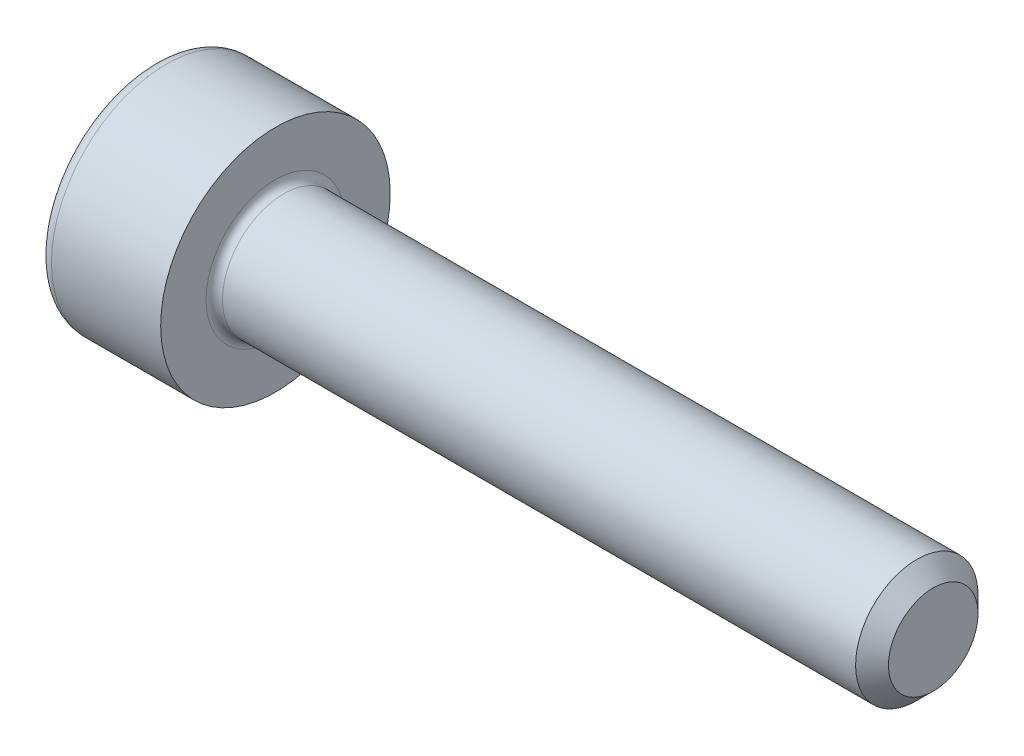
ISO-10303-21;
HEADER;
FILE_DESCRIPTION(('STEP AP214'),'2;1');
FILE_NAME('part.step','',(''),(''),'','','');
FILE_SCHEMA(('AUTOMOTIVE_DESIGN { 1 0 10303 214 1 1 1 1 }'));
ENDSEC;
DATA;
#1=APPLICATION_CONTEXT('core data for automotive mechanical design processes');
#2=APPLICATION_PROTOCOL_DEFINITION('international standard','automotive_design',2000,#1);
#3=PRODUCT_CONTEXT('',#1,'mechanical');
#4=PRODUCT('Part','Part','',(#3));
#5=PRODUCT_RELATED_PRODUCT_CATEGORY('part','',(#4));
#6=PRODUCT_DEFINITION_FORMATION('','',#4);
#7=PRODUCT_DEFINITION_CONTEXT('part definition',#1,'design');
#8=PRODUCT_DEFINITION('design','',#6,#7);
#9=PRODUCT_DEFINITION_SHAPE('','',#8);
#10=(LENGTH_UNIT() NAMED_UNIT(*) SI_UNIT(.MILLI.,.METRE.));
#11=(NAMED_UNIT(*) PLANE_ANGLE_UNIT() SI_UNIT($,.RADIAN.));
#12=(NAMED_UNIT(*) SI_UNIT($,.STERADIAN.) SOLID_ANGLE_UNIT());
#13=UNCERTAINTY_MEASURE_WITH_UNIT(LENGTH_MEASURE(1.E-05),#10,'distance_accuracy_value','');
#14=(GEOMETRIC_REPRESENTATION_CONTEXT(3) GLOBAL_UNCERTAINTY_ASSIGNED_CONTEXT((#13)) GLOBAL_UNIT_ASSIGNED_CONTEXT((#10,
#11,#12)) REPRESENTATION_CONTEXT('',''));
#15=CARTESIAN_POINT('',(0.,0.,0.));
#16=DIRECTION('',(0.,0.,1.));
#17=DIRECTION('',(1.,0.,0.));
#18=AXIS2_PLACEMENT_3D('',#15,#16,#17);
#19=CARTESIAN_POINT('',(0.,0.,0.));
#20=DIRECTION('',(-1.,0.,0.));
#21=DIRECTION('',(0.,0.,1.));
#22=AXIS2_PLACEMENT_3D('',#19,#20,#21);
#23=CYLINDRICAL_SURFACE('',#22,1.39568824458778);
#24=CARTESIAN_POINT('',(0.16,0.,0.));
#25=DIRECTION('',(1.,0.,0.));
#26=DIRECTION('',(0.,0.,-1.));
#27=AXIS2_PLACEMENT_3D('',#24,#25,#26);
#28=CIRCLE('',#27,1.39568824458778);
#29=CARTESIAN_POINT('',(0.16,0.,-1.39568824458778));
#30=VERTEX_POINT('',#29);
#31=EDGE_CURVE('E157',#30,#30,#28,.T.);
#32=ORIENTED_EDGE('',*,*,#31,.T.);
#33=EDGE_LOOP('',(#32));
#34=FACE_BOUND('',#33,.T.);
#35=CARTESIAN_POINT('',(1.48873412756029,0.,0.));
#36=DIRECTION('',(-1.,0.,0.));
#37=DIRECTION('',(0.,0.,1.));
#38=AXIS2_PLACEMENT_3D('',#35,#36,#37);
#39=CIRCLE('',#38,1.39568824458778);
#40=CARTESIAN_POINT('',(1.48873412756029,0.,1.39568824458778));
#41=VERTEX_POINT('',#40);
#42=EDGE_CURVE('E140',#41,#41,#39,.T.);
#43=ORIENTED_EDGE('',*,*,#42,.T.);
#44=EDGE_LOOP('',(#43));
#45=FACE_BOUND('',#44,.T.);
#46=ADVANCED_FACE('F38',(#34,#45),#23,.T.);
#47=CARTESIAN_POINT('',(0.,0.,0.));
#48=DIRECTION('',(1.,0.,0.));
#49=DIRECTION('',(0.,0.,-1.));
#50=AXIS2_PLACEMENT_3D('',#47,#48,#49);
#51=PLANE('',#50);
#52=DIRECTION('',(0.,-0.5,-0.866025403784439));
#53=VECTOR('',#52,1.);
#54=CARTESIAN_POINT('',(0.,0.877572409168232,0.));
#55=LINE('',#54,#53);
#56=CARTESIAN_POINT('',(0.,0.877572409168232,0.));
#57=VERTEX_POINT('',#56);
#58=CARTESIAN_POINT('',(0.,0.438786204584116,-0.760000000000001));
#59=VERTEX_POINT('',#58);
#60=EDGE_CURVE('E127',#57,#59,#55,.T.);
#61=ORIENTED_EDGE('',*,*,#60,.F.);
#62=DIRECTION('',(0.,0.5,-0.866025403784439));
#63=VECTOR('',#62,1.);
#64=CARTESIAN_POINT('',(0.,0.438786204584116,0.76));
#65=LINE('',#64,#63);
#66=CARTESIAN_POINT('',(0.,0.438786204584116,0.76));
#67=VERTEX_POINT('',#66);
#68=EDGE_CURVE('E53',#67,#57,#65,.T.);
#69=ORIENTED_EDGE('',*,*,#68,.F.);
#70=DIRECTION('',(0.,1.,0.));
#71=VECTOR('',#70,1.);
#72=CARTESIAN_POINT('',(0.,-0.438786204584116,0.76));
#73=LINE('',#72,#71);
#74=CARTESIAN_POINT('',(0.,-0.438786204584116,0.76));
#75=VERTEX_POINT('',#74);
#76=EDGE_CURVE('E136',#75,#67,#73,.T.);
#77=ORIENTED_EDGE('',*,*,#76,.F.);
#78=DIRECTION('',(0.,0.5,0.866025403784439));
#79=VECTOR('',#78,1.);
#80=CARTESIAN_POINT('',(0.,-0.877572409168232,0.));
#81=LINE('',#80,#79);
#82=CARTESIAN_POINT('',(0.,-0.877572409168232,0.));
#83=VERTEX_POINT('',#82);
#84=EDGE_CURVE('E134',#83,#75,#81,.T.);
#85=ORIENTED_EDGE('',*,*,#84,.F.);
#86=DIRECTION('',(0.,-0.5,0.866025403784438));
#87=VECTOR('',#86,1.);
#88=CARTESIAN_POINT('',(0.,-0.438786204584116,-0.760000000000001));
#89=LINE('',#88,#87);
#90=CARTESIAN_POINT('',(0.,-0.438786204584116,-0.760000000000001));
#91=VERTEX_POINT('',#90);
#92=EDGE_CURVE('E101',#91,#83,#89,.T.);
#93=ORIENTED_EDGE('',*,*,#92,.F.);
#94=DIRECTION('',(0.,-1.,0.));
#95=VECTOR('',#94,1.);
#96=CARTESIAN_POINT('',(0.,0.438786204584116,-0.760000000000001));
#97=LINE('',#96,#95);
#98=EDGE_CURVE('E130',#59,#91,#97,.T.);
#99=ORIENTED_EDGE('',*,*,#98,.F.);
#100=EDGE_LOOP('',(#61,#69,#77,#85,#93,#99));
#101=FACE_BOUND('',#100,.T.);
#102=CARTESIAN_POINT('',(0.,0.,0.));
#103=DIRECTION('',(1.,0.,0.));
#104=DIRECTION('',(0.,0.,-1.));
#105=AXIS2_PLACEMENT_3D('',#102,#103,#104);
#106=CIRCLE('',#105,1.23568824458778);
#107=CARTESIAN_POINT('',(0.,0.,-1.23568824458778));
#108=VERTEX_POINT('',#107);
#109=EDGE_CURVE('E154',#108,#108,#106,.F.);
#110=ORIENTED_EDGE('',*,*,#109,.T.);
#111=EDGE_LOOP('',(#110));
#112=FACE_BOUND('',#111,.T.);
#113=ADVANCED_FACE('F179',(#101,#112),#51,.F.);
#114=CARTESIAN_POINT('',(9.48873412756029,0.,0.));
#115=DIRECTION('',(-1.,0.,0.));
#116=DIRECTION('',(0.,0.,1.));
#117=AXIS2_PLACEMENT_3D('',#114,#115,#116);
#118=PLANE('',#117);
#119=CARTESIAN_POINT('',(9.48873412756029,0.,0.));
#120=DIRECTION('',(-1.,0.,0.));
#121=DIRECTION('',(0.,0.,1.));
#122=AXIS2_PLACEMENT_3D('',#119,#120,#121);
#123=CIRCLE('',#122,0.544367063780148);
#124=CARTESIAN_POINT('',(9.48873412756029,0.,0.544367063780148));
#125=VERTEX_POINT('',#124);
#126=EDGE_CURVE('E11',#125,#125,#123,.F.);
#127=ORIENTED_EDGE('',*,*,#126,.T.);
#128=EDGE_LOOP('',(#127));
#129=FACE_BOUND('',#128,.T.);
#130=ADVANCED_FACE('F185',(#129),#118,.F.);
#131=CARTESIAN_POINT('',(0.,0.,0.));
#132=DIRECTION('',(-1.,0.,0.));
#133=DIRECTION('',(0.,0.,1.));
#134=AXIS2_PLACEMENT_3D('',#131,#132,#133);
#135=CYLINDRICAL_SURFACE('',#134,0.744367063780147);
#136=CARTESIAN_POINT('',(9.2887341275603,0.,0.));
#137=DIRECTION('',(-1.,0.,0.));
#138=DIRECTION('',(0.,0.,1.));
#139=AXIS2_PLACEMENT_3D('',#136,#137,#138);
#140=CIRCLE('',#139,0.744367063780147);
#141=CARTESIAN_POINT('',(9.2887341275603,0.,0.744367063780147));
#142=VERTEX_POINT('',#141);
#143=EDGE_CURVE('E46',#142,#142,#140,.T.);
#144=ORIENTED_EDGE('',*,*,#143,.T.);
#145=EDGE_LOOP('',(#144));
#146=FACE_BOUND('',#145,.T.);
#147=CARTESIAN_POINT('',(1.58873412756029,0.,0.));
#148=DIRECTION('',(-1.,0.,0.));
#149=DIRECTION('',(0.,0.,1.));
#150=AXIS2_PLACEMENT_3D('',#147,#148,#149);
#151=CIRCLE('',#150,0.744367063780147);
#152=CARTESIAN_POINT('',(1.58873412756029,0.,0.744367063780147));
#153=VERTEX_POINT('',#152);
#154=EDGE_CURVE('E151',#153,#153,#151,.F.);
#155=ORIENTED_EDGE('',*,*,#154,.T.);
#156=EDGE_LOOP('',(#155));
#157=FACE_BOUND('',#156,.T.);
#158=ADVANCED_FACE('F162',(#146,#157),#135,.T.);
#159=CARTESIAN_POINT('',(1.48873412756029,0.,0.));
#160=DIRECTION('',(-1.,0.,0.));
#161=DIRECTION('',(0.,0.,1.));
#162=AXIS2_PLACEMENT_3D('',#159,#160,#161);
#163=PLANE('',#162);
#164=CARTESIAN_POINT('',(1.48873412756029,0.,0.));
#165=DIRECTION('',(-1.,0.,0.));
#166=DIRECTION('',(0.,0.,1.));
#167=AXIS2_PLACEMENT_3D('',#164,#165,#166);
#168=CIRCLE('',#167,0.844367063780147);
#169=CARTESIAN_POINT('',(1.48873412756029,0.,0.844367063780147));
#170=VERTEX_POINT('',#169);
#171=EDGE_CURVE('E148',#170,#170,#168,.T.);
#172=ORIENTED_EDGE('',*,*,#171,.T.);
#173=EDGE_LOOP('',(#172));
#174=FACE_BOUND('',#173,.T.);
#175=ORIENTED_EDGE('',*,*,#42,.F.);
#176=EDGE_LOOP('',(#175));
#177=FACE_BOUND('',#176,.T.);
#178=ADVANCED_FACE('F192',(#174,#177),#163,.F.);
#179=CARTESIAN_POINT('',(1.58873412756029,0.,0.));
#180=DIRECTION('',(-1.,0.,0.));
#181=DIRECTION('',(0.,0.,1.));
#182=AXIS2_PLACEMENT_3D('',#179,#180,#181);
#183=TOROIDAL_SURFACE('',#182,0.844367063780147,0.1);
#184=ORIENTED_EDGE('',*,*,#154,.F.);
#185=EDGE_LOOP('',(#184));
#186=FACE_BOUND('',#185,.T.);
#187=ORIENTED_EDGE('',*,*,#171,.F.);
#188=EDGE_LOOP('',(#187));
#189=FACE_BOUND('',#188,.T.);
#190=ADVANCED_FACE('F175',(#186,#189),#183,.F.);
#191=CARTESIAN_POINT('',(0.16,0.,0.));
#192=DIRECTION('',(1.,0.,0.));
#193=DIRECTION('',(0.,0.,-1.));
#194=AXIS2_PLACEMENT_3D('',#191,#192,#193);
#195=TOROIDAL_SURFACE('',#194,1.23568824458778,0.16);
#196=ORIENTED_EDGE('',*,*,#31,.F.);
#197=EDGE_LOOP('',(#196));
#198=FACE_BOUND('',#197,.T.);
#199=ORIENTED_EDGE('',*,*,#109,.F.);
#200=EDGE_LOOP('',(#199));
#201=FACE_BOUND('',#200,.T.);
#202=ADVANCED_FACE('F167',(#198,#201),#195,.T.);
#203=CARTESIAN_POINT('',(9.2887341275603,0.,0.));
#204=DIRECTION('',(-1.,0.,0.));
#205=DIRECTION('',(0.,0.,1.));
#206=AXIS2_PLACEMENT_3D('',#203,#204,#205);
#207=CONICAL_SURFACE('',#206,0.744367063780147,0.785398163397451);
#208=ORIENTED_EDGE('',*,*,#126,.F.);
#209=EDGE_LOOP('',(#208));
#210=FACE_BOUND('',#209,.T.);
#211=ORIENTED_EDGE('',*,*,#143,.F.);
#212=EDGE_LOOP('',(#211));
#213=FACE_BOUND('',#212,.T.);
#214=ADVANCED_FACE('F40',(#210,#213),#207,.T.);
#215=CARTESIAN_POINT('',(0.7,0.438786204584116,0.76));
#216=DIRECTION('',(0.,0.866025403784439,0.5));
#217=DIRECTION('',(0.,-0.5,0.866025403784439));
#218=AXIS2_PLACEMENT_3D('',#215,#216,#217);
#219=PLANE('',#218);
#220=ORIENTED_EDGE('',*,*,#68,.T.);
#221=DIRECTION('',(-1.,0.,0.));
#222=VECTOR('',#221,1.);
#223=CARTESIAN_POINT('',(0.7,0.877572409168232,0.));
#224=LINE('',#223,#222);
#225=CARTESIAN_POINT('',(0.7,0.877572409168232,0.));
#226=VERTEX_POINT('',#225);
#227=EDGE_CURVE('E83',#226,#57,#224,.T.);
#228=ORIENTED_EDGE('',*,*,#227,.F.);
#229=DIRECTION('',(0.,0.5,-0.866025403784439));
#230=VECTOR('',#229,1.);
#231=CARTESIAN_POINT('',(0.7,0.438786204584116,0.76));
#232=LINE('',#231,#230);
#233=CARTESIAN_POINT('',(0.7,0.438786204584116,0.76));
#234=VERTEX_POINT('',#233);
#235=EDGE_CURVE('E138',#234,#226,#232,.T.);
#236=ORIENTED_EDGE('',*,*,#235,.F.);
#237=DIRECTION('',(-1.,0.,0.));
#238=VECTOR('',#237,1.);
#239=CARTESIAN_POINT('',(0.7,0.438786204584116,0.76));
#240=LINE('',#239,#238);
#241=EDGE_CURVE('E61',#234,#67,#240,.T.);
#242=ORIENTED_EDGE('',*,*,#241,.T.);
#243=EDGE_LOOP('',(#220,#228,#236,#242));
#244=FACE_BOUND('',#243,.T.);
#245=ADVANCED_FACE('F166',(#244),#219,.F.);
#246=CARTESIAN_POINT('',(0.7,-0.438786204584116,0.76));
#247=DIRECTION('',(0.,0.,1.));
#248=DIRECTION('',(1.,0.,0.));
#249=AXIS2_PLACEMENT_3D('',#246,#247,#248);
#250=PLANE('',#249);
#251=ORIENTED_EDGE('',*,*,#76,.T.);
#252=ORIENTED_EDGE('',*,*,#241,.F.);
#253=DIRECTION('',(0.,1.,0.));
#254=VECTOR('',#253,1.);
#255=CARTESIAN_POINT('',(0.7,-0.438786204584116,0.76));
#256=LINE('',#255,#254);
#257=CARTESIAN_POINT('',(0.7,-0.438786204584116,0.76));
#258=VERTEX_POINT('',#257);
#259=EDGE_CURVE('E113',#258,#234,#256,.T.);
#260=ORIENTED_EDGE('',*,*,#259,.F.);
#261=DIRECTION('',(-1.,0.,0.));
#262=VECTOR('',#261,1.);
#263=CARTESIAN_POINT('',(0.7,-0.438786204584116,0.76));
#264=LINE('',#263,#262);
#265=EDGE_CURVE('E105',#258,#75,#264,.T.);
#266=ORIENTED_EDGE('',*,*,#265,.T.);
#267=EDGE_LOOP('',(#251,#252,#260,#266));
#268=FACE_BOUND('',#267,.T.);
#269=ADVANCED_FACE('F173',(#268),#250,.F.);
#270=CARTESIAN_POINT('',(0.7,-0.877572409168232,0.));
#271=DIRECTION('',(0.,-0.866025403784439,0.5));
#272=DIRECTION('',(0.,-0.5,-0.866025403784439));
#273=AXIS2_PLACEMENT_3D('',#270,#271,#272);
#274=PLANE('',#273);
#275=ORIENTED_EDGE('',*,*,#84,.T.);
#276=ORIENTED_EDGE('',*,*,#265,.F.);
#277=DIRECTION('',(0.,0.5,0.866025403784439));
#278=VECTOR('',#277,1.);
#279=CARTESIAN_POINT('',(0.7,-0.877572409168232,0.));
#280=LINE('',#279,#278);
#281=CARTESIAN_POINT('',(0.7,-0.877572409168232,0.));
#282=VERTEX_POINT('',#281);
#283=EDGE_CURVE('E109',#282,#258,#280,.T.);
#284=ORIENTED_EDGE('',*,*,#283,.F.);
#285=DIRECTION('',(-1.,0.,0.));
#286=VECTOR('',#285,1.);
#287=CARTESIAN_POINT('',(0.7,-0.877572409168232,0.));
#288=LINE('',#287,#286);
#289=EDGE_CURVE('E94',#282,#83,#288,.T.);
#290=ORIENTED_EDGE('',*,*,#289,.T.);
#291=EDGE_LOOP('',(#275,#276,#284,#290));
#292=FACE_BOUND('',#291,.T.);
#293=ADVANCED_FACE('F110',(#292),#274,.F.);
#294=CARTESIAN_POINT('',(0.7,-0.438786204584116,-0.760000000000001));
#295=DIRECTION('',(0.,-0.866025403784438,-0.5));
#296=DIRECTION('',(0.,0.5,-0.866025403784438));
#297=AXIS2_PLACEMENT_3D('',#294,#295,#296);
#298=PLANE('',#297);
#299=ORIENTED_EDGE('',*,*,#92,.T.);
#300=ORIENTED_EDGE('',*,*,#289,.F.);
#301=DIRECTION('',(0.,-0.5,0.866025403784438));
#302=VECTOR('',#301,1.);
#303=CARTESIAN_POINT('',(0.7,-0.438786204584116,-0.760000000000001));
#304=LINE('',#303,#302);
#305=CARTESIAN_POINT('',(0.7,-0.438786204584116,-0.760000000000001));
#306=VERTEX_POINT('',#305);
#307=EDGE_CURVE('E98',#306,#282,#304,.T.);
#308=ORIENTED_EDGE('',*,*,#307,.F.);
#309=DIRECTION('',(-1.,0.,0.));
#310=VECTOR('',#309,1.);
#311=CARTESIAN_POINT('',(0.7,-0.438786204584116,-0.760000000000001));
#312=LINE('',#311,#310);
#313=EDGE_CURVE('E106',#306,#91,#312,.T.);
#314=ORIENTED_EDGE('',*,*,#313,.T.);
#315=EDGE_LOOP('',(#299,#300,#308,#314));
#316=FACE_BOUND('',#315,.T.);
#317=ADVANCED_FACE('F96',(#316),#298,.F.);
#318=CARTESIAN_POINT('',(0.7,0.438786204584116,-0.760000000000001));
#319=DIRECTION('',(0.,0.,-1.));
#320=DIRECTION('',(0.,1.,0.));
#321=AXIS2_PLACEMENT_3D('',#318,#319,#320);
#322=PLANE('',#321);
#323=ORIENTED_EDGE('',*,*,#98,.T.);
#324=ORIENTED_EDGE('',*,*,#313,.F.);
#325=DIRECTION('',(0.,-1.,0.));
#326=VECTOR('',#325,1.);
#327=CARTESIAN_POINT('',(0.7,0.438786204584116,-0.760000000000001));
#328=LINE('',#327,#326);
#329=CARTESIAN_POINT('',(0.7,0.438786204584116,-0.760000000000001));
#330=VERTEX_POINT('',#329);
#331=EDGE_CURVE('E119',#330,#306,#328,.T.);
#332=ORIENTED_EDGE('',*,*,#331,.F.);
#333=DIRECTION('',(-1.,0.,0.));
#334=VECTOR('',#333,1.);
#335=CARTESIAN_POINT('',(0.7,0.438786204584116,-0.760000000000001));
#336=LINE('',#335,#334);
#337=EDGE_CURVE('E143',#330,#59,#336,.T.);
#338=ORIENTED_EDGE('',*,*,#337,.T.);
#339=EDGE_LOOP('',(#323,#324,#332,#338));
#340=FACE_BOUND('',#339,.T.);
#341=ADVANCED_FACE('F214',(#340),#322,.F.);
#342=CARTESIAN_POINT('',(0.7,0.877572409168232,0.));
#343=DIRECTION('',(0.,0.866025403784439,-0.5));
#344=DIRECTION('',(0.,0.5,0.866025403784439));
#345=AXIS2_PLACEMENT_3D('',#342,#343,#344);
#346=PLANE('',#345);
#347=ORIENTED_EDGE('',*,*,#60,.T.);
#348=ORIENTED_EDGE('',*,*,#337,.F.);
#349=DIRECTION('',(0.,-0.5,-0.866025403784439));
#350=VECTOR('',#349,1.);
#351=CARTESIAN_POINT('',(0.7,0.877572409168232,0.));
#352=LINE('',#351,#350);
#353=EDGE_CURVE('E121',#226,#330,#352,.T.);
#354=ORIENTED_EDGE('',*,*,#353,.F.);
#355=ORIENTED_EDGE('',*,*,#227,.T.);
#356=EDGE_LOOP('',(#347,#348,#354,#355));
#357=FACE_BOUND('',#356,.T.);
#358=ADVANCED_FACE('F211',(#357),#346,.F.);
#359=CARTESIAN_POINT('',(0.7,0.,0.));
#360=DIRECTION('',(-1.,0.,0.));
#361=DIRECTION('',(0.,0.,1.));
#362=AXIS2_PLACEMENT_3D('',#359,#360,#361);
#363=PLANE('',#362);
#364=ORIENTED_EDGE('',*,*,#235,.T.);
#365=ORIENTED_EDGE('',*,*,#353,.T.);
#366=ORIENTED_EDGE('',*,*,#331,.T.);
#367=ORIENTED_EDGE('',*,*,#307,.T.);
#368=ORIENTED_EDGE('',*,*,#283,.T.);
#369=ORIENTED_EDGE('',*,*,#259,.T.);
#370=EDGE_LOOP('',(#364,#365,#366,#367,#368,#369));
#371=FACE_BOUND('',#370,.T.);
#372=ADVANCED_FACE('F116',(#371),#363,.T.);
#373=CLOSED_SHELL('',(#46,#113,#130,#158,#178,#190,#202,#214,#245,#269,#293,#317,#341,#358,#372));
#374=MANIFOLD_SOLID_BREP('B2',#373);
#375=ADVANCED_BREP_SHAPE_REPRESENTATION('',(#18,#374),#14);
#376=SHAPE_DEFINITION_REPRESENTATION(#9,#375);
ENDSEC;
END-ISO-10303-21;
